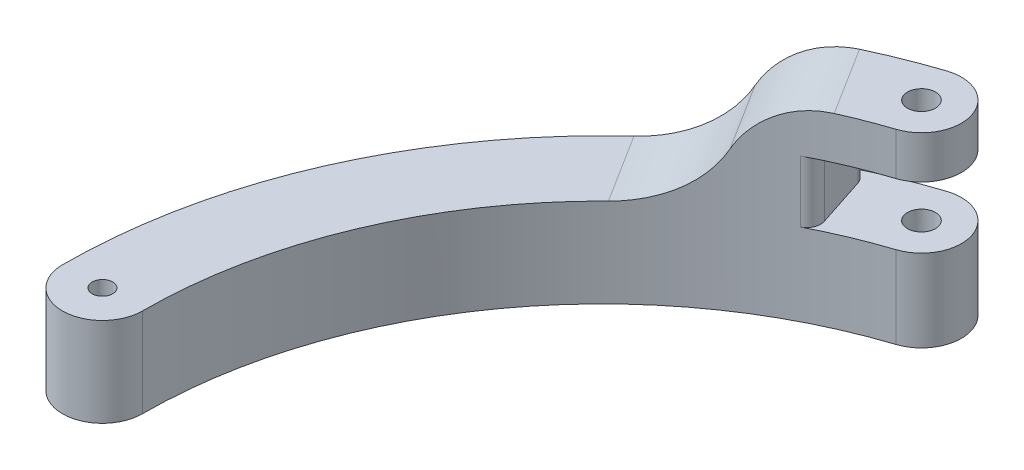
ISO-10303-21;
HEADER;
FILE_DESCRIPTION(('STEP AP214'),'2;1');
FILE_NAME('part.step','',(''),(''),'','','');
FILE_SCHEMA(('AUTOMOTIVE_DESIGN { 1 0 10303 214 1 1 1 1 }'));
ENDSEC;
DATA;
#1=APPLICATION_CONTEXT('core data for automotive mechanical design processes');
#2=APPLICATION_PROTOCOL_DEFINITION('international standard','automotive_design',2000,#1);
#3=PRODUCT_CONTEXT('',#1,'mechanical');
#4=PRODUCT('Part','Part','',(#3));
#5=PRODUCT_RELATED_PRODUCT_CATEGORY('part','',(#4));
#6=PRODUCT_DEFINITION_FORMATION('','',#4);
#7=PRODUCT_DEFINITION_CONTEXT('part definition',#1,'design');
#8=PRODUCT_DEFINITION('design','',#6,#7);
#9=PRODUCT_DEFINITION_SHAPE('','',#8);
#10=(LENGTH_UNIT() NAMED_UNIT(*) SI_UNIT(.MILLI.,.METRE.));
#11=(NAMED_UNIT(*) PLANE_ANGLE_UNIT() SI_UNIT($,.RADIAN.));
#12=(NAMED_UNIT(*) SI_UNIT($,.STERADIAN.) SOLID_ANGLE_UNIT());
#13=UNCERTAINTY_MEASURE_WITH_UNIT(LENGTH_MEASURE(1.E-05),#10,'distance_accuracy_value','');
#14=(GEOMETRIC_REPRESENTATION_CONTEXT(3) GLOBAL_UNCERTAINTY_ASSIGNED_CONTEXT((#13)) GLOBAL_UNIT_ASSIGNED_CONTEXT((#10,
#11,#12)) REPRESENTATION_CONTEXT('',''));
#15=CARTESIAN_POINT('',(0.,0.,0.));
#16=DIRECTION('',(0.,0.,1.));
#17=DIRECTION('',(1.,0.,0.));
#18=AXIS2_PLACEMENT_3D('',#15,#16,#17);
#19=CARTESIAN_POINT('',(-11.3540760869565,6.51002,-34.7022709986191));
#20=DIRECTION('',(0.,-1.,0.));
#21=DIRECTION('',(0.,0.,-1.));
#22=AXIS2_PLACEMENT_3D('',#19,#20,#21);
#23=CYLINDRICAL_SURFACE('',#22,2.9219891931734);
#24=DIRECTION('',(0.,-1.,0.));
#25=VECTOR('',#24,1.);
#26=CARTESIAN_POINT('',(-10.4454423964517,6.51002,-31.9251491681079));
#27=LINE('',#26,#25);
#28=CARTESIAN_POINT('',(-10.4454423964517,13.62202,-31.9251491681079));
#29=VERTEX_POINT('',#28);
#30=CARTESIAN_POINT('',(-10.4454423964517,10.5,-31.925149168108));
#31=VERTEX_POINT('',#30);
#32=EDGE_CURVE('E153',#29,#31,#27,.T.);
#33=ORIENTED_EDGE('',*,*,#32,.T.);
#34=CARTESIAN_POINT('',(-11.3540760869565,10.5,-34.7022709986191));
#35=DIRECTION('',(0.,1.,0.));
#36=DIRECTION('',(0.,0.,1.));
#37=AXIS2_PLACEMENT_3D('',#34,#35,#36);
#38=CIRCLE('',#37,2.9219891931734);
#39=CARTESIAN_POINT('',(-12.2627097774613,10.5,-37.4793928291303));
#40=VERTEX_POINT('',#39);
#41=EDGE_CURVE('E233',#31,#40,#38,.T.);
#42=ORIENTED_EDGE('',*,*,#41,.T.);
#43=DIRECTION('',(0.,-1.,0.));
#44=VECTOR('',#43,1.);
#45=CARTESIAN_POINT('',(-12.2627097774613,6.51002,-37.4793928291303));
#46=LINE('',#45,#44);
#47=CARTESIAN_POINT('',(-12.2627097774613,13.62202,-37.4793928291303));
#48=VERTEX_POINT('',#47);
#49=EDGE_CURVE('E144',#48,#40,#46,.T.);
#50=ORIENTED_EDGE('',*,*,#49,.F.);
#51=CARTESIAN_POINT('',(-11.3540760869565,13.62202,-34.7022709986191));
#52=DIRECTION('',(0.,1.,0.));
#53=DIRECTION('',(0.,0.,1.));
#54=AXIS2_PLACEMENT_3D('',#51,#52,#53);
#55=CIRCLE('',#54,2.92198919317341);
#56=EDGE_CURVE('E235',#29,#48,#55,.T.);
#57=ORIENTED_EDGE('',*,*,#56,.F.);
#58=EDGE_LOOP('',(#33,#42,#50,#57));
#59=FACE_BOUND('',#58,.T.);
#60=ADVANCED_FACE('F32',(#59),#23,.T.);
#61=CARTESIAN_POINT('',(-18.25625,6.51002,0.));
#62=DIRECTION('',(0.,-1.,0.));
#63=DIRECTION('',(0.,0.,-1.));
#64=AXIS2_PLACEMENT_3D('',#61,#62,#63);
#65=PLANE('',#64);
#66=CARTESIAN_POINT('',(-36.5125,6.51002,0.));
#67=DIRECTION('',(0.,1.,0.));
#68=DIRECTION('',(0.,0.,1.));
#69=AXIS2_PLACEMENT_3D('',#66,#67,#68);
#70=CIRCLE('',#69,0.749999999999999);
#71=CARTESIAN_POINT('',(-36.5125,6.51002,0.749999999999999));
#72=VERTEX_POINT('',#71);
#73=EDGE_CURVE('E255',#72,#72,#70,.T.);
#74=ORIENTED_EDGE('',*,*,#73,.F.);
#75=EDGE_LOOP('',(#74));
#76=FACE_BOUND('',#75,.T.);
#77=CARTESIAN_POINT('',(0.,6.51002,0.));
#78=DIRECTION('',(0.,-1.,0.));
#79=DIRECTION('',(0.,0.,-1.));
#80=AXIS2_PLACEMENT_3D('',#77,#78,#79);
#81=CIRCLE('',#80,33.5905108068266);
#82=CARTESIAN_POINT('',(-33.5905108068266,6.51002,0.));
#83=VERTEX_POINT('',#82);
#84=CARTESIAN_POINT('',(-23.5157875457056,6.51002,-23.9860407814373));
#85=VERTEX_POINT('',#84);
#86=EDGE_CURVE('E267',#83,#85,#81,.T.);
#87=ORIENTED_EDGE('',*,*,#86,.T.);
#88=DIRECTION('',(0.53301305407991,0.,0.846107016978589));
#89=VECTOR('',#88,1.);
#90=CARTESIAN_POINT('',(-27.0366106256863,6.51002,-29.575009176694));
#91=LINE('',#90,#89);
#92=CARTESIAN_POINT('',(-26.6919509583045,6.51002,-29.0278950660563));
#93=VERTEX_POINT('',#92);
#94=EDGE_CURVE('E159',#85,#93,#91,.F.);
#95=ORIENTED_EDGE('',*,*,#94,.T.);
#96=CARTESIAN_POINT('',(0.,6.51002,0.));
#97=DIRECTION('',(0.,1.,0.));
#98=DIRECTION('',(0.,0.,-1.));
#99=AXIS2_PLACEMENT_3D('',#96,#97,#98);
#100=CIRCLE('',#99,39.4344891931734);
#101=CARTESIAN_POINT('',(-39.4344891931734,6.51002,0.));
#102=VERTEX_POINT('',#101);
#103=EDGE_CURVE('E149',#93,#102,#100,.T.);
#104=ORIENTED_EDGE('',*,*,#103,.T.);
#105=CARTESIAN_POINT('',(-36.5125,6.51002,0.));
#106=DIRECTION('',(0.,1.,0.));
#107=DIRECTION('',(0.,0.,-1.));
#108=AXIS2_PLACEMENT_3D('',#105,#106,#107);
#109=CIRCLE('',#108,2.9219891931734);
#110=EDGE_CURVE('E264',#102,#83,#109,.T.);
#111=ORIENTED_EDGE('',*,*,#110,.T.);
#112=EDGE_LOOP('',(#87,#95,#104,#111));
#113=FACE_BOUND('',#112,.T.);
#114=ADVANCED_FACE('F224',(#76,#113),#65,.F.);
#115=CARTESIAN_POINT('',(-18.25625,0.,0.));
#116=DIRECTION('',(0.,-1.,0.));
#117=DIRECTION('',(0.,0.,-1.));
#118=AXIS2_PLACEMENT_3D('',#115,#116,#117);
#119=PLANE('',#118);
#120=CARTESIAN_POINT('',(-11.3540760869565,0.,-34.7022709986191));
#121=DIRECTION('',(0.,1.,0.));
#122=DIRECTION('',(0.,0.,1.));
#123=AXIS2_PLACEMENT_3D('',#120,#121,#122);
#124=CIRCLE('',#123,1.025);
#125=CARTESIAN_POINT('',(-11.3540760869565,0.,-33.6772709986191));
#126=VERTEX_POINT('',#125);
#127=EDGE_CURVE('E258',#126,#126,#124,.T.);
#128=ORIENTED_EDGE('',*,*,#127,.T.);
#129=EDGE_LOOP('',(#128));
#130=FACE_BOUND('',#129,.T.);
#131=CARTESIAN_POINT('',(-36.5125,0.,0.));
#132=DIRECTION('',(0.,1.,0.));
#133=DIRECTION('',(0.,0.,-1.));
#134=AXIS2_PLACEMENT_3D('',#131,#132,#133);
#135=CIRCLE('',#134,2.9219891931734);
#136=CARTESIAN_POINT('',(-39.4344891931734,0.,0.));
#137=VERTEX_POINT('',#136);
#138=CARTESIAN_POINT('',(-33.5905108068266,0.,0.));
#139=VERTEX_POINT('',#138);
#140=EDGE_CURVE('E263',#137,#139,#135,.T.);
#141=ORIENTED_EDGE('',*,*,#140,.F.);
#142=CARTESIAN_POINT('',(0.,0.,0.));
#143=DIRECTION('',(0.,1.,0.));
#144=DIRECTION('',(0.,0.,-1.));
#145=AXIS2_PLACEMENT_3D('',#142,#143,#144);
#146=CIRCLE('',#145,39.4344891931734);
#147=CARTESIAN_POINT('',(-12.2627097774613,0.,-37.4793928291303));
#148=VERTEX_POINT('',#147);
#149=EDGE_CURVE('E268',#148,#137,#146,.T.);
#150=ORIENTED_EDGE('',*,*,#149,.F.);
#151=CARTESIAN_POINT('',(-11.3540760869565,0.,-34.7022709986191));
#152=DIRECTION('',(0.,1.,0.));
#153=DIRECTION('',(0.,0.,1.));
#154=AXIS2_PLACEMENT_3D('',#151,#152,#153);
#155=CIRCLE('',#154,2.9219891931734);
#156=CARTESIAN_POINT('',(-10.4454423964517,0.,-31.9251491681079));
#157=VERTEX_POINT('',#156);
#158=EDGE_CURVE('E142',#157,#148,#155,.T.);
#159=ORIENTED_EDGE('',*,*,#158,.F.);
#160=CARTESIAN_POINT('',(0.,0.,0.));
#161=DIRECTION('',(0.,-1.,0.));
#162=DIRECTION('',(0.,0.,-1.));
#163=AXIS2_PLACEMENT_3D('',#160,#161,#162);
#164=CIRCLE('',#163,33.5905108068266);
#165=EDGE_CURVE('E274',#139,#157,#164,.T.);
#166=ORIENTED_EDGE('',*,*,#165,.F.);
#167=EDGE_LOOP('',(#141,#150,#159,#166));
#168=FACE_BOUND('',#167,.T.);
#169=CARTESIAN_POINT('',(-36.5125,0.,0.));
#170=DIRECTION('',(0.,1.,0.));
#171=DIRECTION('',(0.,0.,1.));
#172=AXIS2_PLACEMENT_3D('',#169,#170,#171);
#173=CIRCLE('',#172,0.749999999999999);
#174=CARTESIAN_POINT('',(-36.5125,0.,0.749999999999999));
#175=VERTEX_POINT('',#174);
#176=EDGE_CURVE('E254',#175,#175,#173,.T.);
#177=ORIENTED_EDGE('',*,*,#176,.T.);
#178=EDGE_LOOP('',(#177));
#179=FACE_BOUND('',#178,.T.);
#180=ADVANCED_FACE('F215',(#130,#168,#179),#119,.T.);
#181=CARTESIAN_POINT('',(-36.5125,6.51002,0.));
#182=DIRECTION('',(0.,-1.,0.));
#183=DIRECTION('',(0.,0.,-1.));
#184=AXIS2_PLACEMENT_3D('',#181,#182,#183);
#185=CYLINDRICAL_SURFACE('',#184,2.9219891931734);
#186=ORIENTED_EDGE('',*,*,#140,.T.);
#187=DIRECTION('',(0.,-1.,0.));
#188=VECTOR('',#187,1.);
#189=CARTESIAN_POINT('',(-33.5905108068266,6.51002,0.));
#190=LINE('',#189,#188);
#191=EDGE_CURVE('E156',#83,#139,#190,.T.);
#192=ORIENTED_EDGE('',*,*,#191,.F.);
#193=ORIENTED_EDGE('',*,*,#110,.F.);
#194=DIRECTION('',(0.,-1.,0.));
#195=VECTOR('',#194,1.);
#196=CARTESIAN_POINT('',(-39.4344891931734,6.51002,0.));
#197=LINE('',#196,#195);
#198=EDGE_CURVE('E145',#102,#137,#197,.T.);
#199=ORIENTED_EDGE('',*,*,#198,.T.);
#200=EDGE_LOOP('',(#186,#192,#193,#199));
#201=FACE_BOUND('',#200,.T.);
#202=ADVANCED_FACE('F187',(#201),#185,.T.);
#203=CARTESIAN_POINT('',(0.,6.51002,0.));
#204=DIRECTION('',(0.,-1.,0.));
#205=DIRECTION('',(0.,0.,-1.));
#206=AXIS2_PLACEMENT_3D('',#203,#204,#205);
#207=CYLINDRICAL_SURFACE('',#206,33.5905108068266);
#208=DIRECTION('',(0.,-1.,0.));
#209=VECTOR('',#208,1.);
#210=CARTESIAN_POINT('',(-15.3524419154899,6.51002,-29.8768295422229));
#211=LINE('',#210,#209);
#212=CARTESIAN_POINT('',(-15.3524419154899,6.,-29.8768295422229));
#213=VERTEX_POINT('',#212);
#214=CARTESIAN_POINT('',(-15.3524419154899,10.5,-29.8768295422229));
#215=VERTEX_POINT('',#214);
#216=EDGE_CURVE('E242',#213,#215,#211,.F.);
#217=ORIENTED_EDGE('',*,*,#216,.T.);
#218=CARTESIAN_POINT('',(0.,10.5,0.));
#219=DIRECTION('',(0.,1.,0.));
#220=DIRECTION('',(0.,0.,1.));
#221=AXIS2_PLACEMENT_3D('',#218,#219,#220);
#222=CIRCLE('',#221,33.5905108068266);
#223=EDGE_CURVE('E240',#215,#31,#222,.F.);
#224=ORIENTED_EDGE('',*,*,#223,.T.);
#225=ORIENTED_EDGE('',*,*,#32,.F.);
#226=CARTESIAN_POINT('',(0.,13.62202,0.));
#227=DIRECTION('',(0.,-1.,0.));
#228=DIRECTION('',(0.,0.,1.));
#229=AXIS2_PLACEMENT_3D('',#226,#227,#228);
#230=CIRCLE('',#229,33.5905108068266);
#231=CARTESIAN_POINT('',(-13.6976446744955,13.62202,-30.6707832739042));
#232=VERTEX_POINT('',#231);
#233=EDGE_CURVE('E239',#232,#29,#230,.T.);
#234=ORIENTED_EDGE('',*,*,#233,.F.);
#235=CARTESIAN_POINT('',(-13.6976446744955,13.62202,-30.6707832739042));
#236=CARTESIAN_POINT('',(-13.8592250615874,13.6220404351881,-30.5986361179426));
#237=CARTESIAN_POINT('',(-14.0202282085904,13.6147723816411,-30.5251857853603));
#238=CARTESIAN_POINT('',(-14.3399809771496,13.5857041479126,-30.376277251151));
#239=CARTESIAN_POINT('',(-14.4987305608992,13.5639037242244,-30.3008190158997));
#240=CARTESIAN_POINT('',(-14.8126983772716,13.5058476468721,-30.1485796456726));
#241=CARTESIAN_POINT('',(-14.9679203127027,13.4696079677895,-30.071800062063));
#242=CARTESIAN_POINT('',(-15.2739530411511,13.3828687742414,-29.9175219969972));
#243=CARTESIAN_POINT('',(-15.4247639993349,13.3323697944637,-29.8400235426022));
#244=CARTESIAN_POINT('',(-15.7210792491252,13.2173760001463,-29.6849805600497));
#245=CARTESIAN_POINT('',(-15.8665797382339,13.1528713781049,-29.607436037773));
#246=CARTESIAN_POINT('',(-16.1512207998429,13.0103100536416,-29.4531270628242));
#247=CARTESIAN_POINT('',(-16.2903612264426,12.932253040523,-29.3763626280788));
#248=CARTESIAN_POINT('',(-16.5614402487913,12.763100998403,-29.2243950879253));
#249=CARTESIAN_POINT('',(-16.693376984562,12.6720026239343,-29.1491923888308));
#250=CARTESIAN_POINT('',(-16.9492084821266,12.4774245218794,-29.0011825727373));
#251=CARTESIAN_POINT('',(-17.07310357399,12.3739453029617,-28.9283753574761));
#252=CARTESIAN_POINT('',(-17.3118888781056,12.1555642968278,-28.7861112051593));
#253=CARTESIAN_POINT('',(-17.4267975099738,12.040687031266,-28.7166475335972));
#254=CARTESIAN_POINT('',(-17.6472638893797,11.80013818979,-28.5816934721594));
#255=CARTESIAN_POINT('',(-17.7528218603889,11.6744668719844,-28.5162029873402));
#256=CARTESIAN_POINT('',(-17.9538950848736,11.4133911598934,-28.3900359505457));
#257=CARTESIAN_POINT('',(-18.0494235406246,11.2779999660919,-28.32935309659));
#258=CARTESIAN_POINT('',(-18.2300794076261,10.9983298441875,-28.2134389363833));
#259=CARTESIAN_POINT('',(-18.3152123545329,10.8540557084066,-28.1582047317392));
#260=CARTESIAN_POINT('',(-18.4333515686043,10.6344613402648,-28.0808844737714));
#261=CARTESIAN_POINT('',(-18.4705060486482,10.5621579503435,-28.0564551445819));
#262=CARTESIAN_POINT('',(-18.5422241668648,10.4159385132317,-28.0091088594187));
#263=CARTESIAN_POINT('',(-18.5767916119952,10.3420250508774,-27.9861896873597));
#264=CARTESIAN_POINT('',(-18.6100794512656,10.2673030188679,-27.9640368881376));
#265=B_SPLINE_CURVE_WITH_KNOTS('',3,(#235,#236,#237,#238,#239,#240,#241,#242,#243,#244,#245,
#246,#247,#248,#249,#250,#251,#252,#253,#254,#255,#256,#257,#258,#259,#260,#261,#262,#263,#264),
.UNSPECIFIED.,.F.,.F.,(4,2,2,2,2,2,2,2,2,2,2,2,2,2,4),(0.,0.530719530132275,1.06144795331186,
1.5915908388521,2.12171384801116,2.65220928188982,3.1827168793052,3.71336081116472,
4.24398294893463,4.77348729351818,5.30297898005445,5.83176469697689,6.36026759363046,
6.61485672411489,6.86906353014044),.UNSPECIFIED.);
#266=CARTESIAN_POINT('',(-18.6100794512656,10.2673030188679,-27.9640368881376));
#267=VERTEX_POINT('',#266);
#268=EDGE_CURVE('E196',#232,#267,#265,.T.);
#269=ORIENTED_EDGE('',*,*,#268,.T.);
#270=CARTESIAN_POINT('',(-17.9041807532509,13.62202,-28.4211668975511));
#271=CARTESIAN_POINT('',(-17.9041554232942,13.4220762162792,-28.4211669723756));
#272=CARTESIAN_POINT('',(-17.9113138897044,13.2221355076676,-28.4166728125162));
#273=CARTESIAN_POINT('',(-17.939815459405,12.8236829898762,-28.3986964946733));
#274=CARTESIAN_POINT('',(-17.9611579090729,12.6251711152792,-28.3852147508532));
#275=CARTESIAN_POINT('',(-18.0178253151264,12.2311138810572,-28.3492759166275));
#276=CARTESIAN_POINT('',(-18.0531407870773,12.0355666024494,-28.3268249141639));
#277=CARTESIAN_POINT('',(-18.1373968119977,11.6486913426405,-28.2729511751152));
#278=CARTESIAN_POINT('',(-18.1863371981757,11.4573633098196,-28.2415285483576));
#279=CARTESIAN_POINT('',(-18.2973824222051,11.0802198124459,-28.1697102938303));
#280=CARTESIAN_POINT('',(-18.3594917214314,10.8944062404674,-28.1293116249271));
#281=CARTESIAN_POINT('',(-18.4962793426213,10.529619084092,-28.0395570153782));
#282=CARTESIAN_POINT('',(-18.5709620463822,10.3506479110261,-27.9901979515882));
#283=CARTESIAN_POINT('',(-18.7321253597546,10.0009518986579,-27.8825980678431));
#284=CARTESIAN_POINT('',(-18.8186019939872,9.83022430683708,-27.8243602398759));
#285=CARTESIAN_POINT('',(-19.002532268019,9.49817525116298,-27.6990714642036));
#286=CARTESIAN_POINT('',(-19.099985837646,9.33685372718945,-27.6320205728375));
#287=CARTESIAN_POINT('',(-19.3047536914703,9.0250416358192,-27.4893513877792));
#288=CARTESIAN_POINT('',(-19.4120508857272,8.87453307653568,-27.4137478913544));
#289=CARTESIAN_POINT('',(-19.6355804265566,8.58517353693689,-27.2540868377028));
#290=CARTESIAN_POINT('',(-19.7518097705867,8.44631867178426,-27.1700321184506));
#291=CARTESIAN_POINT('',(-19.9921505576621,8.18117925704559,-26.9936760493012));
#292=CARTESIAN_POINT('',(-20.116263526123,8.05489715239444,-26.9013731020263));
#293=CARTESIAN_POINT('',(-20.3711741579824,7.81583364968679,-26.7088596416461));
#294=CARTESIAN_POINT('',(-20.5019716843972,7.70305197513013,-26.6086492905607));
#295=CARTESIAN_POINT('',(-20.7680089319824,7.49257989942007,-26.40152300441));
#296=CARTESIAN_POINT('',(-20.9032071190106,7.39478086455517,-26.2946640995906));
#297=CARTESIAN_POINT('',(-21.1777532776566,7.21389752960772,-26.0740521072319));
#298=CARTESIAN_POINT('',(-21.317101218921,7.13081312192607,-25.9602990701134));
#299=CARTESIAN_POINT('',(-21.598693381058,6.97988782838003,-25.7264907210397));
#300=CARTESIAN_POINT('',(-21.7409370697612,6.91204416872274,-25.6064365607939));
#301=CARTESIAN_POINT('',(-22.0270646447818,6.7919739354343,-25.3607263085745));
#302=CARTESIAN_POINT('',(-22.1709481877815,6.73974415306228,-25.2350713736996));
#303=CARTESIAN_POINT('',(-22.5164027181113,6.63355705699801,-24.9280231779886));
#304=CARTESIAN_POINT('',(-22.7182534052945,6.58710701265549,-24.7442632452661));
#305=CARTESIAN_POINT('',(-23.0191856578257,6.54078777823842,-24.4634093085697));
#306=CARTESIAN_POINT('',(-23.1191266322003,6.52924060815686,-24.3689835445866));
#307=CARTESIAN_POINT('',(-23.3181652069445,6.51385706225242,-24.1785971541654));
#308=CARTESIAN_POINT('',(-23.4172626818004,6.51002181466798,-24.082636305217));
#309=CARTESIAN_POINT('',(-23.5157875457056,6.51002,-23.9860407814373));
#310=B_SPLINE_CURVE_WITH_KNOTS('',3,(#270,#271,#272,#273,#274,#275,#276,#277,#278,#279,#280,
#281,#282,#283,#284,#285,#286,#287,#288,#289,#290,#291,#292,#293,#294,#295,#296,#297,#298,#299,
#300,#301,#302,#303,#304,#305,#306,#307,#308,#309),.UNSPECIFIED.,.F.,.F.,(4,2,2,2,2,2,2,2,2,2,2,
2,2,2,2,2,2,2,2,4),(0.,0.599648442733626,1.19926925454482,1.79848375948967,2.39769092937731,
2.9971014244326,3.59672124646435,4.19613945193973,4.79555382572584,5.39394654365517,
5.99213898439505,6.59044752506164,7.18874380976853,7.78247271783156,8.376197284138,
8.9698137057774,9.56330805186134,10.3918397268398,10.8055837679113,11.2193883344845),.UNSPECIFIED.);
#311=EDGE_CURVE('E161',#267,#85,#310,.T.);
#312=ORIENTED_EDGE('',*,*,#311,.T.);
#313=ORIENTED_EDGE('',*,*,#86,.F.);
#314=ORIENTED_EDGE('',*,*,#191,.T.);
#315=ORIENTED_EDGE('',*,*,#165,.T.);
#316=CARTESIAN_POINT('',(-10.4454423964517,6.,-31.925149168108));
#317=VERTEX_POINT('',#316);
#318=EDGE_CURVE('E147',#317,#157,#27,.T.);
#319=ORIENTED_EDGE('',*,*,#318,.F.);
#320=CARTESIAN_POINT('',(0.,6.,0.));
#321=DIRECTION('',(0.,-1.,0.));
#322=DIRECTION('',(0.,0.,-1.));
#323=AXIS2_PLACEMENT_3D('',#320,#321,#322);
#324=CIRCLE('',#323,33.5905108068266);
#325=EDGE_CURVE('E128',#317,#213,#324,.F.);
#326=ORIENTED_EDGE('',*,*,#325,.T.);
#327=EDGE_LOOP('',(#217,#224,#225,#234,#269,#312,#313,#314,#315,#319,#326));
#328=FACE_BOUND('',#327,.T.);
#329=ADVANCED_FACE('F176',(#328),#207,.F.);
#330=CARTESIAN_POINT('',(-12.2627097774613,6.,-37.4793928291303));
#331=VERTEX_POINT('',#330);
#332=EDGE_CURVE('E134',#331,#148,#46,.T.);
#333=ORIENTED_EDGE('',*,*,#332,.F.);
#334=CARTESIAN_POINT('',(-11.3540760869565,6.,-34.7022709986191));
#335=DIRECTION('',(0.,-1.,0.));
#336=DIRECTION('',(0.,0.,-1.));
#337=AXIS2_PLACEMENT_3D('',#334,#335,#336);
#338=CIRCLE('',#337,2.9219891931734);
#339=EDGE_CURVE('E125',#331,#317,#338,.T.);
#340=ORIENTED_EDGE('',*,*,#339,.T.);
#341=ORIENTED_EDGE('',*,*,#318,.T.);
#342=ORIENTED_EDGE('',*,*,#158,.T.);
#343=EDGE_LOOP('',(#333,#340,#341,#342));
#344=FACE_BOUND('',#343,.T.);
#345=ADVANCED_FACE('F140',(#344),#23,.T.);
#346=CARTESIAN_POINT('',(0.,6.51002,0.));
#347=DIRECTION('',(0.,-1.,0.));
#348=DIRECTION('',(0.,0.,-1.));
#349=AXIS2_PLACEMENT_3D('',#346,#347,#348);
#350=CYLINDRICAL_SURFACE('',#349,39.4344891931734);
#351=DIRECTION('',(0.,-1.,0.));
#352=VECTOR('',#351,1.);
#353=CARTESIAN_POINT('',(-17.465704211237,6.51002,-35.3557366537891));
#354=LINE('',#353,#352);
#355=CARTESIAN_POINT('',(-17.465704211237,10.5,-35.3557366537891));
#356=VERTEX_POINT('',#355);
#357=CARTESIAN_POINT('',(-17.465704211237,6.,-35.3557366537891));
#358=VERTEX_POINT('',#357);
#359=EDGE_CURVE('E137',#356,#358,#354,.T.);
#360=ORIENTED_EDGE('',*,*,#359,.T.);
#361=CARTESIAN_POINT('',(0.,6.,0.));
#362=DIRECTION('',(0.,-1.,0.));
#363=DIRECTION('',(0.,0.,-1.));
#364=AXIS2_PLACEMENT_3D('',#361,#362,#363);
#365=CIRCLE('',#364,39.4344891931734);
#366=EDGE_CURVE('E47',#358,#331,#365,.T.);
#367=ORIENTED_EDGE('',*,*,#366,.T.);
#368=ORIENTED_EDGE('',*,*,#332,.T.);
#369=ORIENTED_EDGE('',*,*,#149,.T.);
#370=ORIENTED_EDGE('',*,*,#198,.F.);
#371=ORIENTED_EDGE('',*,*,#103,.F.);
#372=CARTESIAN_POINT('',(-26.6919509583045,6.51002,-29.0278950660563));
#373=CARTESIAN_POINT('',(-26.5449448513139,6.50999779148609,-29.1630913818322));
#374=CARTESIAN_POINT('',(-26.3968863513432,6.51815848394541,-29.2971545692226));
#375=CARTESIAN_POINT('',(-26.099761061275,6.55082792689526,-29.5621502355997));
#376=CARTESIAN_POINT('',(-25.950694214956,6.57533759650491,-29.6930825381432));
#377=CARTESIAN_POINT('',(-25.6527426580415,6.64067033102889,-29.9508698336059));
#378=CARTESIAN_POINT('',(-25.5038578931049,6.68148494322668,-30.0777269024262));
#379=CARTESIAN_POINT('',(-25.2073772506838,6.77924091271471,-30.3266304064657));
#380=CARTESIAN_POINT('',(-25.0597813149525,6.83618153728481,-30.4486770599696));
#381=CARTESIAN_POINT('',(-24.7669323309248,6.9659439960823,-30.6873545336297));
#382=CARTESIAN_POINT('',(-24.6216818254791,7.03878196719939,-30.8039797036298));
#383=CARTESIAN_POINT('',(-24.334910737563,7.19985281031339,-31.0310249161192));
#384=CARTESIAN_POINT('',(-24.1933901984138,7.2880858610242,-31.1414448865556));
#385=CARTESIAN_POINT('',(-23.9153611231841,7.47932743010277,-31.3554654209334));
#386=CARTESIAN_POINT('',(-23.77885089152,7.5823308908827,-31.4590683014956));
#387=CARTESIAN_POINT('',(-23.5120037521718,7.80242382476011,-31.6590021599473));
#388=CARTESIAN_POINT('',(-23.3816667623222,7.91951311030287,-31.7553332346342));
#389=CARTESIAN_POINT('',(-23.129427510588,8.1658863244403,-31.9395163448108));
#390=CARTESIAN_POINT('',(-23.007462314336,8.29505663787847,-32.0274342144233));
#391=CARTESIAN_POINT('',(-22.7717998284732,8.56556836550538,-32.1954192676073));
#392=CARTESIAN_POINT('',(-22.658105217422,8.70691369067857,-32.2754839106864));
#393=CARTESIAN_POINT('',(-22.4400409873115,9.00075641164015,-32.4274755319223));
#394=CARTESIAN_POINT('',(-22.3356721981654,9.15325479775759,-32.499401785988));
#395=CARTESIAN_POINT('',(-22.1372152595824,9.46831814342234,-32.6349058627732));
#396=CARTESIAN_POINT('',(-22.043127177158,9.63088316857594,-32.6984836310755));
#397=CARTESIAN_POINT('',(-21.8657441645778,9.96558634543784,-32.8173676525437));
#398=CARTESIAN_POINT('',(-21.7824926433516,10.1377592765263,-32.8726407675897));
#399=CARTESIAN_POINT('',(-21.6280083682417,10.4898169823052,-32.9744863803084));
#400=CARTESIAN_POINT('',(-21.5567715719658,10.6696991375546,-33.0210618049145));
#401=CARTESIAN_POINT('',(-21.4269569111001,11.0359290234956,-33.1054445098469));
#402=CARTESIAN_POINT('',(-21.3683760815723,11.2222752279438,-33.1432538439747));
#403=CARTESIAN_POINT('',(-21.2644108932944,11.600080078073,-33.2100522264141));
#404=CARTESIAN_POINT('',(-21.2190237176497,11.7915376229188,-33.2390431575492));
#405=CARTESIAN_POINT('',(-21.1269563503286,12.2530388204741,-33.2976692042647));
#406=CARTESIAN_POINT('',(-21.0865327411068,12.5249042895509,-33.323237835889));
#407=CARTESIAN_POINT('',(-21.0460882758261,12.9351443444726,-33.3487828342231));
#408=CARTESIAN_POINT('',(-21.0359719605843,13.072241877262,-33.3551631808626));
#409=CARTESIAN_POINT('',(-21.0224771394336,13.3468869325832,-33.3636693255419));
#410=CARTESIAN_POINT('',(-21.0190980019985,13.4844344117275,-33.3657955223552));
#411=CARTESIAN_POINT('',(-21.0190975209346,13.62202,-33.3657980173103));
#412=B_SPLINE_CURVE_WITH_KNOTS('',3,(#372,#373,#374,#375,#376,#377,#378,#379,#380,#381,#382,
#383,#384,#385,#386,#387,#388,#389,#390,#391,#392,#393,#394,#395,#396,#397,#398,#399,#400,#401,
#402,#403,#404,#405,#406,#407,#408,#409,#410,#411),.UNSPECIFIED.,.F.,.F.,(4,2,2,2,2,2,2,2,2,2,2,
2,2,2,2,2,2,2,2,4),(0.,0.599004435023808,1.19804254816902,1.79677051351292,2.39547127872408,
2.99478261606043,3.59410091097004,4.19321447906889,4.79232007076984,5.38626992641085,
5.98041129348598,6.5746054811732,7.16880354174958,7.76531302334767,8.36162140533855,
8.95778993715288,9.5538310911083,10.3798236212619,10.7924851144044,11.2051079238744),.UNSPECIFIED.);
#413=CARTESIAN_POINT('',(-21.725828002991,10.2673030188679,-32.9099883851538));
#414=VERTEX_POINT('',#413);
#415=EDGE_CURVE('E169',#93,#414,#412,.T.);
#416=ORIENTED_EDGE('',*,*,#415,.T.);
#417=CARTESIAN_POINT('',(-21.725828002991,10.2673030188679,-32.9099883851539));
#418=CARTESIAN_POINT('',(-21.6557286958559,10.424321888136,-32.9562617500576));
#419=CARTESIAN_POINT('',(-21.5799494004547,10.5777898154316,-33.0059700129091));
#420=CARTESIAN_POINT('',(-21.4174781454993,10.8765794206826,-33.111629581934));
#421=CARTESIAN_POINT('',(-21.3307864405704,11.0219012886003,-33.167580742435));
#422=CARTESIAN_POINT('',(-21.1470067877386,11.3032509630768,-33.2850552790211));
#423=CARTESIAN_POINT('',(-21.0499270840016,11.4392860014803,-33.3465742304812));
#424=CARTESIAN_POINT('',(-20.8458496266109,11.701223141983,-33.4745275677278));
#425=CARTESIAN_POINT('',(-20.7388520841002,11.8271254596932,-33.5409618488648));
#426=CARTESIAN_POINT('',(-20.5154759694468,12.0679696839632,-33.6780545717493));
#427=CARTESIAN_POINT('',(-20.3990923148051,12.1829055777637,-33.7487152966571));
#428=CARTESIAN_POINT('',(-20.1576696816656,12.4009213061871,-33.8934668685467));
#429=CARTESIAN_POINT('',(-20.0326305599524,12.5040009445586,-33.9675577722781));
#430=CARTESIAN_POINT('',(-19.7746272371161,12.697585651485,-34.1184024426066));
#431=CARTESIAN_POINT('',(-19.641661551358,12.7880883537554,-34.1951567069154));
#432=CARTESIAN_POINT('',(-19.368660686604,12.9558520282155,-34.3505252183328));
#433=CARTESIAN_POINT('',(-19.2286258177494,13.0331135806723,-34.429139383763));
#434=CARTESIAN_POINT('',(-18.9429300681216,13.173592743747,-34.5871490803771));
#435=CARTESIAN_POINT('',(-18.7972927189688,13.2368628683816,-34.6665404802329));
#436=CARTESIAN_POINT('',(-18.5008502911036,13.3493082832044,-34.825648143435));
#437=CARTESIAN_POINT('',(-18.3500453673507,13.3984839956267,-34.9053643969769));
#438=CARTESIAN_POINT('',(-18.044499387136,13.4823736950194,-35.0642923402031));
#439=CARTESIAN_POINT('',(-17.8897641317759,13.5171078153848,-35.1435045797062));
#440=CARTESIAN_POINT('',(-17.5772680873479,13.5720053714841,-35.3008378283478));
#441=CARTESIAN_POINT('',(-17.4195090188147,13.5921768546167,-35.3789594167429));
#442=CARTESIAN_POINT('',(-17.190852150576,13.6107046750237,-35.4902748187928));
#443=CARTESIAN_POINT('',(-17.1207238412583,13.6149522394581,-35.5241583713939));
#444=CARTESIAN_POINT('',(-16.9802761570879,13.6206076964649,-35.5915048177662));
#445=CARTESIAN_POINT('',(-16.9099572046363,13.6220196826443,-35.6249682485428));
#446=CARTESIAN_POINT('',(-16.8395313668738,13.62202,-35.6582265581251));
#447=B_SPLINE_CURVE_WITH_KNOTS('',3,(#417,#418,#419,#420,#421,#422,#423,#424,#425,#426,#427,
#428,#429,#430,#431,#432,#433,#434,#435,#436,#437,#438,#439,#440,#441,#442,#443,#444,#445,#446),
.UNSPECIFIED.,.F.,.F.,(4,2,2,2,2,2,2,2,2,2,2,2,2,2,4),(0.,0.534058996586532,1.068105533983,
1.60173133926234,2.13534578668058,2.66925114720914,3.20316534396469,3.73717985826572,
4.27117096445241,4.80312247901894,5.33505805595593,5.86624954088859,6.39714726113969,
6.63110582936592,6.86472639777245),.UNSPECIFIED.);
#448=CARTESIAN_POINT('',(-16.8395313668738,13.62202,-35.6582265581252));
#449=VERTEX_POINT('',#448);
#450=EDGE_CURVE('E203',#414,#449,#447,.T.);
#451=ORIENTED_EDGE('',*,*,#450,.T.);
#452=CARTESIAN_POINT('',(0.,13.62202,0.));
#453=DIRECTION('',(0.,1.,0.));
#454=DIRECTION('',(0.,0.,1.));
#455=AXIS2_PLACEMENT_3D('',#452,#453,#454);
#456=CIRCLE('',#455,39.4344891931734);
#457=EDGE_CURVE('E246',#48,#449,#456,.T.);
#458=ORIENTED_EDGE('',*,*,#457,.F.);
#459=ORIENTED_EDGE('',*,*,#49,.T.);
#460=CARTESIAN_POINT('',(0.,10.5,0.));
#461=DIRECTION('',(0.,1.,0.));
#462=DIRECTION('',(0.,0.,1.));
#463=AXIS2_PLACEMENT_3D('',#460,#461,#462);
#464=CIRCLE('',#463,39.4344891931734);
#465=EDGE_CURVE('E55',#40,#356,#464,.T.);
#466=ORIENTED_EDGE('',*,*,#465,.T.);
#467=EDGE_LOOP('',(#360,#367,#368,#369,#370,#371,#416,#451,#458,#459,#466));
#468=FACE_BOUND('',#467,.T.);
#469=ADVANCED_FACE('F133',(#468),#350,.T.);
#470=CARTESIAN_POINT('',(-11.3540760869565,6.51002,-34.7022709986191));
#471=DIRECTION('',(0.,-1.,0.));
#472=DIRECTION('',(0.,0.,-1.));
#473=AXIS2_PLACEMENT_3D('',#470,#471,#472);
#474=CYLINDRICAL_SURFACE('',#473,1.025);
#475=CARTESIAN_POINT('',(-11.3540760869565,6.,-34.7022709986191));
#476=DIRECTION('',(0.,-1.,0.));
#477=DIRECTION('',(0.,0.,-1.));
#478=AXIS2_PLACEMENT_3D('',#475,#476,#477);
#479=CIRCLE('',#478,1.025);
#480=CARTESIAN_POINT('',(-11.3540760869565,6.,-35.7272709986191));
#481=VERTEX_POINT('',#480);
#482=EDGE_CURVE('E138',#481,#481,#479,.T.);
#483=ORIENTED_EDGE('',*,*,#482,.F.);
#484=EDGE_LOOP('',(#483));
#485=FACE_BOUND('',#484,.T.);
#486=ORIENTED_EDGE('',*,*,#127,.F.);
#487=EDGE_LOOP('',(#486));
#488=FACE_BOUND('',#487,.T.);
#489=ADVANCED_FACE('F214',(#485,#488),#474,.F.);
#490=CARTESIAN_POINT('',(-36.5125,6.51002,0.));
#491=DIRECTION('',(0.,-1.,0.));
#492=DIRECTION('',(0.,0.,-1.));
#493=AXIS2_PLACEMENT_3D('',#490,#491,#492);
#494=CYLINDRICAL_SURFACE('',#493,0.749999999999999);
#495=ORIENTED_EDGE('',*,*,#73,.T.);
#496=EDGE_LOOP('',(#495));
#497=FACE_BOUND('',#496,.T.);
#498=ORIENTED_EDGE('',*,*,#176,.F.);
#499=EDGE_LOOP('',(#498));
#500=FACE_BOUND('',#499,.T.);
#501=ADVANCED_FACE('F298',(#497,#500),#494,.F.);
#502=CARTESIAN_POINT('',(-11.3540760869565,13.62202,-34.7022709986191));
#503=DIRECTION('',(0.,1.,0.));
#504=DIRECTION('',(0.,0.,1.));
#505=AXIS2_PLACEMENT_3D('',#502,#503,#504);
#506=PLANE('',#505);
#507=CARTESIAN_POINT('',(-11.3540760869565,13.62202,-34.7022709986191));
#508=DIRECTION('',(0.,1.,0.));
#509=DIRECTION('',(0.,0.,1.));
#510=AXIS2_PLACEMENT_3D('',#507,#508,#509);
#511=CIRCLE('',#510,1.025);
#512=CARTESIAN_POINT('',(-11.3540760869565,13.62202,-33.6772709986191));
#513=VERTEX_POINT('',#512);
#514=EDGE_CURVE('E404',#513,#513,#511,.T.);
#515=ORIENTED_EDGE('',*,*,#514,.F.);
#516=EDGE_LOOP('',(#515));
#517=FACE_BOUND('',#516,.T.);
#518=ORIENTED_EDGE('',*,*,#457,.T.);
#519=DIRECTION('',(0.53301305407991,0.,0.846107016978589));
#520=VECTOR('',#519,1.);
#521=CARTESIAN_POINT('',(-13.878188157201,13.62202,-30.9573787079514));
#522=LINE('',#521,#520);
#523=EDGE_CURVE('E292',#449,#232,#522,.T.);
#524=ORIENTED_EDGE('',*,*,#523,.T.);
#525=ORIENTED_EDGE('',*,*,#233,.T.);
#526=ORIENTED_EDGE('',*,*,#56,.T.);
#527=EDGE_LOOP('',(#518,#524,#525,#526));
#528=FACE_BOUND('',#527,.T.);
#529=ADVANCED_FACE('F185',(#517,#528),#506,.T.);
#530=CARTESIAN_POINT('',(-23.9216938580026,13.62202,-24.6303780569348));
#531=DIRECTION('',(-0.53301305407991,0.,-0.846107016978589));
#532=DIRECTION('',(-0.846107016978589,0.,0.53301305407991));
#533=AXIS2_PLACEMENT_3D('',#530,#531,#532);
#534=CYLINDRICAL_SURFACE('',#533,7.112);
#535=ORIENTED_EDGE('',*,*,#311,.F.);
#536=DIRECTION('',(-0.53301305407991,0.,-0.846107016978589));
#537=VECTOR('',#536,1.);
#538=CARTESIAN_POINT('',(-18.6156908462584,10.2673030188679,-27.9729444386039));
#539=LINE('',#538,#537);
#540=EDGE_CURVE('E209',#267,#414,#539,.T.);
#541=ORIENTED_EDGE('',*,*,#540,.T.);
#542=ORIENTED_EDGE('',*,*,#415,.F.);
#543=ORIENTED_EDGE('',*,*,#94,.F.);
#544=EDGE_LOOP('',(#535,#541,#542,#543));
#545=FACE_BOUND('',#544,.T.);
#546=ADVANCED_FACE('F180',(#545),#534,.F.);
#547=CARTESIAN_POINT('',(-13.878188157201,7.27202,-30.9573787079514));
#548=DIRECTION('',(-0.53301305407991,0.,-0.846107016978589));
#549=DIRECTION('',(-0.846107016978589,0.,0.53301305407991));
#550=AXIS2_PLACEMENT_3D('',#547,#548,#549);
#551=CYLINDRICAL_SURFACE('',#550,6.35);
#552=ORIENTED_EDGE('',*,*,#450,.F.);
#553=ORIENTED_EDGE('',*,*,#540,.F.);
#554=ORIENTED_EDGE('',*,*,#268,.F.);
#555=ORIENTED_EDGE('',*,*,#523,.F.);
#556=EDGE_LOOP('',(#552,#553,#554,#555));
#557=FACE_BOUND('',#556,.T.);
#558=ADVANCED_FACE('F184',(#557),#551,.T.);
#559=CARTESIAN_POINT('',(-9.88202863966324,10.5,-44.4974029150738));
#560=DIRECTION('',(0.,1.,0.));
#561=DIRECTION('',(0.,0.,1.));
#562=AXIS2_PLACEMENT_3D('',#559,#560,#561);
#563=PLANE('',#562);
#564=CARTESIAN_POINT('',(-11.3540760869565,10.5,-34.7022709986191));
#565=DIRECTION('',(0.,1.,0.));
#566=DIRECTION('',(0.,0.,1.));
#567=AXIS2_PLACEMENT_3D('',#564,#565,#566);
#568=CIRCLE('',#567,1.025);
#569=CARTESIAN_POINT('',(-11.3540760869565,10.5,-33.6772709986191));
#570=VERTEX_POINT('',#569);
#571=EDGE_CURVE('E419',#570,#570,#568,.T.);
#572=ORIENTED_EDGE('',*,*,#571,.T.);
#573=EDGE_LOOP('',(#572));
#574=FACE_BOUND('',#573,.T.);
#575=ORIENTED_EDGE('',*,*,#223,.F.);
#576=CARTESIAN_POINT('',(-15.8168016591043,10.5,-30.7805031716436));
#577=DIRECTION('',(0.,1.,0.));
#578=DIRECTION('',(0.,0.,1.));
#579=AXIS2_PLACEMENT_3D('',#576,#577,#578);
#580=CIRCLE('',#579,1.016);
#581=CARTESIAN_POINT('',(-14.851173248708,10.5,-31.0964426801502));
#582=VERTEX_POINT('',#581);
#583=EDGE_CURVE('E399',#215,#582,#580,.T.);
#584=ORIENTED_EDGE('',*,*,#583,.T.);
#585=DIRECTION('',(-0.310964083175803,0.,-0.950421663775943));
#586=VECTOR('',#585,1.);
#587=CARTESIAN_POINT('',(-18.3312772306314,10.5,-41.732932215641));
#588=LINE('',#587,#586);
#589=CARTESIAN_POINT('',(-16.0500850480331,10.5,-34.760762158458));
#590=VERTEX_POINT('',#589);
#591=EDGE_CURVE('E398',#582,#590,#588,.T.);
#592=ORIENTED_EDGE('',*,*,#591,.T.);
#593=CARTESIAN_POINT('',(-17.0157134584295,10.5,-34.4448226499513));
#594=DIRECTION('',(0.,1.,0.));
#595=DIRECTION('',(0.,0.,1.));
#596=AXIS2_PLACEMENT_3D('',#593,#594,#595);
#597=CIRCLE('',#596,1.016);
#598=EDGE_CURVE('E11',#590,#356,#597,.T.);
#599=ORIENTED_EDGE('',*,*,#598,.T.);
#600=ORIENTED_EDGE('',*,*,#465,.F.);
#601=ORIENTED_EDGE('',*,*,#41,.F.);
#602=EDGE_LOOP('',(#575,#584,#592,#599,#600,#601));
#603=FACE_BOUND('',#602,.T.);
#604=ADVANCED_FACE('F191',(#574,#603),#563,.F.);
#605=CARTESIAN_POINT('',(-4.22462429548407,0.,1.38223534971645));
#606=DIRECTION('',(-0.950421663775943,0.,0.310964083175803));
#607=DIRECTION('',(0.310964083175803,0.,0.950421663775943));
#608=AXIS2_PLACEMENT_3D('',#605,#606,#607);
#609=PLANE('',#608);
#610=ORIENTED_EDGE('',*,*,#591,.F.);
#611=DIRECTION('',(0.,-1.,0.));
#612=VECTOR('',#611,1.);
#613=CARTESIAN_POINT('',(-14.851173248708,0.,-31.0964426801502));
#614=LINE('',#613,#612);
#615=CARTESIAN_POINT('',(-14.851173248708,6.,-31.0964426801502));
#616=VERTEX_POINT('',#615);
#617=EDGE_CURVE('E412',#582,#616,#614,.T.);
#618=ORIENTED_EDGE('',*,*,#617,.T.);
#619=DIRECTION('',(0.310964083175803,0.,0.950421663775943));
#620=VECTOR('',#619,1.);
#621=CARTESIAN_POINT('',(-18.3312772306314,6.,-41.732932215641));
#622=LINE('',#621,#620);
#623=CARTESIAN_POINT('',(-16.0500850480331,6.,-34.760762158458));
#624=VERTEX_POINT('',#623);
#625=EDGE_CURVE('E401',#624,#616,#622,.T.);
#626=ORIENTED_EDGE('',*,*,#625,.F.);
#627=DIRECTION('',(0.,-1.,0.));
#628=VECTOR('',#627,1.);
#629=CARTESIAN_POINT('',(-16.0500850480331,0.,-34.760762158458));
#630=LINE('',#629,#628);
#631=EDGE_CURVE('E395',#624,#590,#630,.F.);
#632=ORIENTED_EDGE('',*,*,#631,.T.);
#633=EDGE_LOOP('',(#610,#618,#626,#632));
#634=FACE_BOUND('',#633,.T.);
#635=ADVANCED_FACE('F355',(#634),#609,.F.);
#636=CARTESIAN_POINT('',(-9.88202863966324,6.,-44.4974029150738));
#637=DIRECTION('',(0.,-1.,0.));
#638=DIRECTION('',(0.,0.,-1.));
#639=AXIS2_PLACEMENT_3D('',#636,#637,#638);
#640=PLANE('',#639);
#641=ORIENTED_EDGE('',*,*,#482,.T.);
#642=EDGE_LOOP('',(#641));
#643=FACE_BOUND('',#642,.T.);
#644=ORIENTED_EDGE('',*,*,#339,.F.);
#645=ORIENTED_EDGE('',*,*,#366,.F.);
#646=CARTESIAN_POINT('',(-17.0157134584295,6.,-34.4448226499513));
#647=DIRECTION('',(0.,-1.,0.));
#648=DIRECTION('',(0.,0.,-1.));
#649=AXIS2_PLACEMENT_3D('',#646,#647,#648);
#650=CIRCLE('',#649,1.016);
#651=EDGE_CURVE('E40',#358,#624,#650,.T.);
#652=ORIENTED_EDGE('',*,*,#651,.T.);
#653=ORIENTED_EDGE('',*,*,#625,.T.);
#654=CARTESIAN_POINT('',(-15.8168016591043,6.,-30.7805031716436));
#655=DIRECTION('',(0.,-1.,0.));
#656=DIRECTION('',(0.,0.,-1.));
#657=AXIS2_PLACEMENT_3D('',#654,#655,#656);
#658=CIRCLE('',#657,1.016);
#659=EDGE_CURVE('E408',#616,#213,#658,.T.);
#660=ORIENTED_EDGE('',*,*,#659,.T.);
#661=ORIENTED_EDGE('',*,*,#325,.F.);
#662=EDGE_LOOP('',(#644,#645,#652,#653,#660,#661));
#663=FACE_BOUND('',#662,.T.);
#664=ADVANCED_FACE('F126',(#643,#663),#640,.F.);
#665=CARTESIAN_POINT('',(-11.3540760869565,13.9809822144064,-34.7022709986191));
#666=DIRECTION('',(0.,-1.,0.));
#667=DIRECTION('',(0.,0.,-1.));
#668=AXIS2_PLACEMENT_3D('',#665,#666,#667);
#669=CYLINDRICAL_SURFACE('',#668,1.025);
#670=ORIENTED_EDGE('',*,*,#514,.T.);
#671=EDGE_LOOP('',(#670));
#672=FACE_BOUND('',#671,.T.);
#673=ORIENTED_EDGE('',*,*,#571,.F.);
#674=EDGE_LOOP('',(#673));
#675=FACE_BOUND('',#674,.T.);
#676=ADVANCED_FACE('F339',(#672,#675),#669,.F.);
#677=CARTESIAN_POINT('',(-15.8168016591043,6.51002,-30.7805031716436));
#678=DIRECTION('',(0.,-1.,0.));
#679=DIRECTION('',(0.,0.,-1.));
#680=AXIS2_PLACEMENT_3D('',#677,#678,#679);
#681=CYLINDRICAL_SURFACE('',#680,1.016);
#682=ORIENTED_EDGE('',*,*,#659,.F.);
#683=ORIENTED_EDGE('',*,*,#617,.F.);
#684=ORIENTED_EDGE('',*,*,#583,.F.);
#685=ORIENTED_EDGE('',*,*,#216,.F.);
#686=EDGE_LOOP('',(#682,#683,#684,#685));
#687=FACE_BOUND('',#686,.T.);
#688=ADVANCED_FACE('F193',(#687),#681,.T.);
#689=CARTESIAN_POINT('',(-17.0157134584295,6.51002,-34.4448226499513));
#690=DIRECTION('',(0.,-1.,0.));
#691=DIRECTION('',(0.,0.,-1.));
#692=AXIS2_PLACEMENT_3D('',#689,#690,#691);
#693=CYLINDRICAL_SURFACE('',#692,1.016);
#694=ORIENTED_EDGE('',*,*,#598,.F.);
#695=ORIENTED_EDGE('',*,*,#631,.F.);
#696=ORIENTED_EDGE('',*,*,#651,.F.);
#697=ORIENTED_EDGE('',*,*,#359,.F.);
#698=EDGE_LOOP('',(#694,#695,#696,#697));
#699=FACE_BOUND('',#698,.T.);
#700=ADVANCED_FACE('F34',(#699),#693,.T.);
#701=CLOSED_SHELL('',(#60,#114,#180,#202,#329,#345,#469,#489,#501,#529,#546,#558,#604,#635,#664,
#676,#688,#700));
#702=MANIFOLD_SOLID_BREP('B2',#701);
#703=ADVANCED_BREP_SHAPE_REPRESENTATION('',(#18,#702),#14);
#704=SHAPE_DEFINITION_REPRESENTATION(#9,#703);
ENDSEC;
END-ISO-10303-21;
